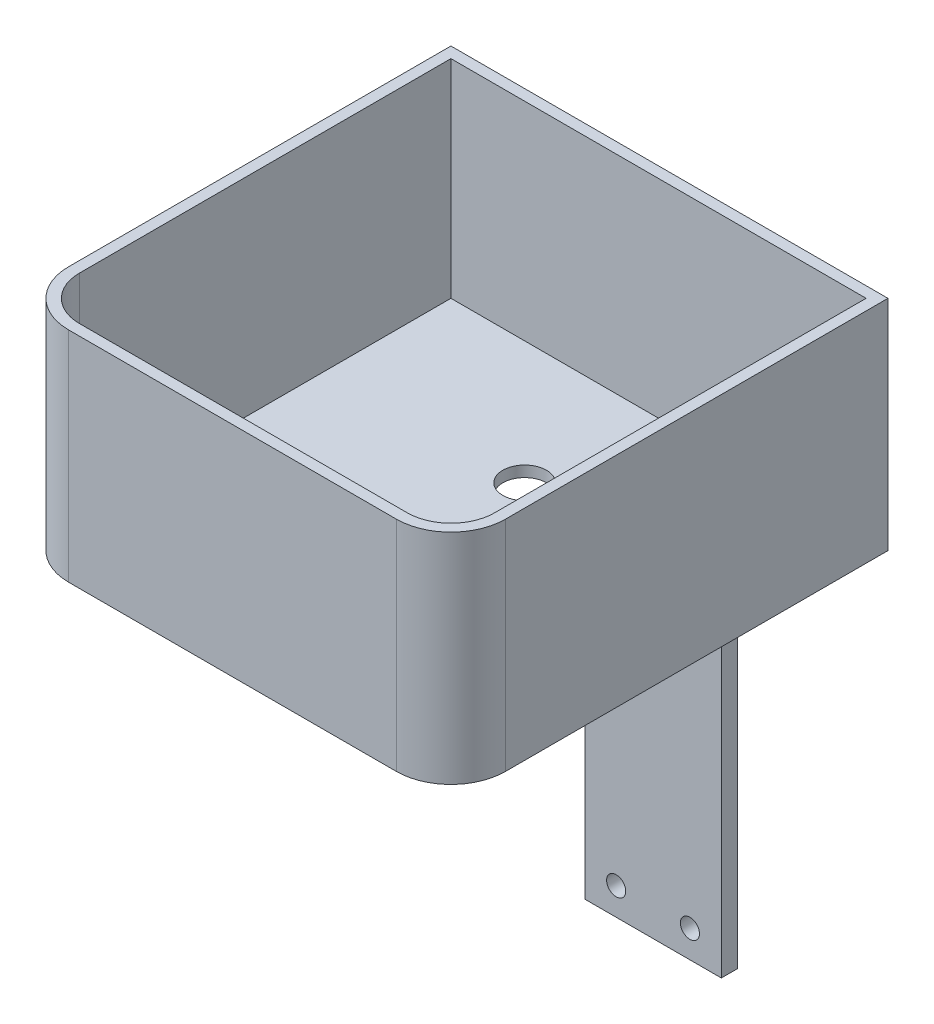
ISO-10303-21;
HEADER;
FILE_DESCRIPTION(('STEP AP214'),'2;1');
FILE_NAME('part.step','',(''),(''),'','','');
FILE_SCHEMA(('AUTOMOTIVE_DESIGN { 1 0 10303 214 1 1 1 1 }'));
ENDSEC;
DATA;
#1=APPLICATION_CONTEXT('core data for automotive mechanical design processes');
#2=APPLICATION_PROTOCOL_DEFINITION('international standard','automotive_design',2000,#1);
#3=PRODUCT_CONTEXT('',#1,'mechanical');
#4=PRODUCT('Part','Part','',(#3));
#5=PRODUCT_RELATED_PRODUCT_CATEGORY('part','',(#4));
#6=PRODUCT_DEFINITION_FORMATION('','',#4);
#7=PRODUCT_DEFINITION_CONTEXT('part definition',#1,'design');
#8=PRODUCT_DEFINITION('design','',#6,#7);
#9=PRODUCT_DEFINITION_SHAPE('','',#8);
#10=(LENGTH_UNIT() NAMED_UNIT(*) SI_UNIT(.MILLI.,.METRE.));
#11=(NAMED_UNIT(*) PLANE_ANGLE_UNIT() SI_UNIT($,.RADIAN.));
#12=(NAMED_UNIT(*) SI_UNIT($,.STERADIAN.) SOLID_ANGLE_UNIT());
#13=UNCERTAINTY_MEASURE_WITH_UNIT(LENGTH_MEASURE(1.E-05),#10,'distance_accuracy_value','');
#14=(GEOMETRIC_REPRESENTATION_CONTEXT(3) GLOBAL_UNCERTAINTY_ASSIGNED_CONTEXT((#13)) GLOBAL_UNIT_ASSIGNED_CONTEXT((#10,
#11,#12)) REPRESENTATION_CONTEXT('',''));
#15=CARTESIAN_POINT('',(0.,0.,0.));
#16=DIRECTION('',(0.,0.,1.));
#17=DIRECTION('',(1.,0.,0.));
#18=AXIS2_PLACEMENT_3D('',#15,#16,#17);
#19=CARTESIAN_POINT('',(0.,90.,3.));
#20=DIRECTION('',(0.,1.,0.));
#21=DIRECTION('',(-1.,0.,0.));
#22=AXIS2_PLACEMENT_3D('',#19,#20,#21);
#23=PLANE('',#22);
#24=DIRECTION('',(-1.,0.,0.));
#25=VECTOR('',#24,1.);
#26=CARTESIAN_POINT('',(-40.,90.,80.));
#27=LINE('',#26,#25);
#28=CARTESIAN_POINT('',(30.,90.,80.));
#29=VERTEX_POINT('',#28);
#30=CARTESIAN_POINT('',(-30.,90.,80.));
#31=VERTEX_POINT('',#30);
#32=EDGE_CURVE('E239',#29,#31,#27,.T.);
#33=ORIENTED_EDGE('',*,*,#32,.F.);
#34=CARTESIAN_POINT('',(30.,90.,70.));
#35=DIRECTION('',(0.,1.,0.));
#36=DIRECTION('',(-1.,0.,0.));
#37=AXIS2_PLACEMENT_3D('',#34,#35,#36);
#38=CIRCLE('',#37,10.);
#39=CARTESIAN_POINT('',(40.,90.,70.));
#40=VERTEX_POINT('',#39);
#41=EDGE_CURVE('E295',#29,#40,#38,.T.);
#42=ORIENTED_EDGE('',*,*,#41,.T.);
#43=DIRECTION('',(0.,0.,-1.));
#44=VECTOR('',#43,1.);
#45=CARTESIAN_POINT('',(40.,90.,3.));
#46=LINE('',#45,#44);
#47=CARTESIAN_POINT('',(40.,90.,0.));
#48=VERTEX_POINT('',#47);
#49=EDGE_CURVE('E283',#40,#48,#46,.T.);
#50=ORIENTED_EDGE('',*,*,#49,.T.);
#51=DIRECTION('',(1.,0.,0.));
#52=VECTOR('',#51,1.);
#53=CARTESIAN_POINT('',(0.,90.,0.));
#54=LINE('',#53,#52);
#55=CARTESIAN_POINT('',(-40.,90.,0.));
#56=VERTEX_POINT('',#55);
#57=EDGE_CURVE('E261',#56,#48,#54,.T.);
#58=ORIENTED_EDGE('',*,*,#57,.F.);
#59=DIRECTION('',(0.,0.,-1.));
#60=VECTOR('',#59,1.);
#61=CARTESIAN_POINT('',(-40.,90.,3.));
#62=LINE('',#61,#60);
#63=CARTESIAN_POINT('',(-40.,90.,70.));
#64=VERTEX_POINT('',#63);
#65=EDGE_CURVE('E281',#64,#56,#62,.T.);
#66=ORIENTED_EDGE('',*,*,#65,.F.);
#67=CARTESIAN_POINT('',(-30.,90.,70.));
#68=DIRECTION('',(0.,1.,0.));
#69=DIRECTION('',(-1.,0.,0.));
#70=AXIS2_PLACEMENT_3D('',#67,#68,#69);
#71=CIRCLE('',#70,10.);
#72=EDGE_CURVE('E293',#64,#31,#71,.T.);
#73=ORIENTED_EDGE('',*,*,#72,.T.);
#74=EDGE_LOOP('',(#33,#42,#50,#58,#66,#73));
#75=FACE_BOUND('',#74,.T.);
#76=CARTESIAN_POINT('',(30.,90.,70.));
#77=DIRECTION('',(0.,1.,0.));
#78=DIRECTION('',(-1.,0.,0.));
#79=AXIS2_PLACEMENT_3D('',#76,#77,#78);
#80=CIRCLE('',#79,8.);
#81=CARTESIAN_POINT('',(30.,90.,78.));
#82=VERTEX_POINT('',#81);
#83=CARTESIAN_POINT('',(38.,90.,70.));
#84=VERTEX_POINT('',#83);
#85=EDGE_CURVE('E234',#82,#84,#80,.T.);
#86=ORIENTED_EDGE('',*,*,#85,.F.);
#87=DIRECTION('',(-1.,0.,0.));
#88=VECTOR('',#87,1.);
#89=CARTESIAN_POINT('',(0.,90.,78.));
#90=LINE('',#89,#88);
#91=CARTESIAN_POINT('',(-30.,90.,78.));
#92=VERTEX_POINT('',#91);
#93=EDGE_CURVE('E211',#82,#92,#90,.T.);
#94=ORIENTED_EDGE('',*,*,#93,.T.);
#95=CARTESIAN_POINT('',(-30.,90.,70.));
#96=DIRECTION('',(0.,1.,0.));
#97=DIRECTION('',(-1.,0.,0.));
#98=AXIS2_PLACEMENT_3D('',#95,#96,#97);
#99=CIRCLE('',#98,8.);
#100=CARTESIAN_POINT('',(-38.,90.,70.));
#101=VERTEX_POINT('',#100);
#102=EDGE_CURVE('E229',#101,#92,#99,.T.);
#103=ORIENTED_EDGE('',*,*,#102,.F.);
#104=DIRECTION('',(0.,0.,-1.));
#105=VECTOR('',#104,1.);
#106=CARTESIAN_POINT('',(-38.,90.,3.));
#107=LINE('',#106,#105);
#108=CARTESIAN_POINT('',(-38.,90.,2.));
#109=VERTEX_POINT('',#108);
#110=EDGE_CURVE('E230',#101,#109,#107,.T.);
#111=ORIENTED_EDGE('',*,*,#110,.T.);
#112=DIRECTION('',(1.,0.,0.));
#113=VECTOR('',#112,1.);
#114=CARTESIAN_POINT('',(0.,90.,2.));
#115=LINE('',#114,#113);
#116=CARTESIAN_POINT('',(38.,90.,2.));
#117=VERTEX_POINT('',#116);
#118=EDGE_CURVE('E210',#109,#117,#115,.T.);
#119=ORIENTED_EDGE('',*,*,#118,.T.);
#120=DIRECTION('',(0.,0.,-1.));
#121=VECTOR('',#120,1.);
#122=CARTESIAN_POINT('',(38.,90.,3.));
#123=LINE('',#122,#121);
#124=EDGE_CURVE('E206',#84,#117,#123,.T.);
#125=ORIENTED_EDGE('',*,*,#124,.F.);
#126=EDGE_LOOP('',(#86,#94,#103,#111,#119,#125));
#127=FACE_BOUND('',#126,.T.);
#128=ADVANCED_FACE('F35',(#75,#127),#23,.T.);
#129=CARTESIAN_POINT('',(0.,0.,3.));
#130=DIRECTION('',(0.,0.,1.));
#131=DIRECTION('',(1.,0.,0.));
#132=AXIS2_PLACEMENT_3D('',#129,#130,#131);
#133=PLANE('',#132);
#134=CARTESIAN_POINT('',(-6.75,-25.,3.));
#135=DIRECTION('',(0.,0.,1.));
#136=DIRECTION('',(1.,0.,0.));
#137=AXIS2_PLACEMENT_3D('',#134,#135,#136);
#138=CIRCLE('',#137,1.75);
#139=CARTESIAN_POINT('',(-4.99999999999999,-25.,3.));
#140=VERTEX_POINT('',#139);
#141=EDGE_CURVE('E322',#140,#140,#138,.T.);
#142=ORIENTED_EDGE('',*,*,#141,.F.);
#143=EDGE_LOOP('',(#142));
#144=FACE_BOUND('',#143,.T.);
#145=CARTESIAN_POINT('',(6.75,-25.,3.));
#146=DIRECTION('',(0.,0.,1.));
#147=DIRECTION('',(1.,0.,0.));
#148=AXIS2_PLACEMENT_3D('',#145,#146,#147);
#149=CIRCLE('',#148,1.75);
#150=CARTESIAN_POINT('',(8.5,-25.,3.));
#151=VERTEX_POINT('',#150);
#152=EDGE_CURVE('E318',#151,#151,#149,.T.);
#153=ORIENTED_EDGE('',*,*,#152,.F.);
#154=EDGE_LOOP('',(#153));
#155=FACE_BOUND('',#154,.T.);
#156=CARTESIAN_POINT('',(6.75,25.,3.));
#157=DIRECTION('',(0.,0.,1.));
#158=DIRECTION('',(1.,0.,0.));
#159=AXIS2_PLACEMENT_3D('',#156,#157,#158);
#160=CIRCLE('',#159,1.75);
#161=CARTESIAN_POINT('',(8.49999999999999,25.,3.));
#162=VERTEX_POINT('',#161);
#163=EDGE_CURVE('E314',#162,#162,#160,.T.);
#164=ORIENTED_EDGE('',*,*,#163,.F.);
#165=EDGE_LOOP('',(#164));
#166=FACE_BOUND('',#165,.T.);
#167=CARTESIAN_POINT('',(-6.75,25.,3.));
#168=DIRECTION('',(0.,0.,1.));
#169=DIRECTION('',(1.,0.,0.));
#170=AXIS2_PLACEMENT_3D('',#167,#168,#169);
#171=CIRCLE('',#170,1.75);
#172=CARTESIAN_POINT('',(-5.,25.,3.));
#173=VERTEX_POINT('',#172);
#174=EDGE_CURVE('E310',#173,#173,#171,.T.);
#175=ORIENTED_EDGE('',*,*,#174,.F.);
#176=EDGE_LOOP('',(#175));
#177=FACE_BOUND('',#176,.T.);
#178=DIRECTION('',(0.,-1.,0.));
#179=VECTOR('',#178,1.);
#180=CARTESIAN_POINT('',(12.5,0.,3.));
#181=LINE('',#180,#179);
#182=CARTESIAN_POINT('',(12.5,23.7867965644036,3.));
#183=VERTEX_POINT('',#182);
#184=CARTESIAN_POINT('',(12.5,-30.,3.));
#185=VERTEX_POINT('',#184);
#186=EDGE_CURVE('E245',#183,#185,#181,.T.);
#187=ORIENTED_EDGE('',*,*,#186,.F.);
#188=CARTESIAN_POINT('',(27.5,23.7867965644036,3.));
#189=DIRECTION('',(0.,0.,1.));
#190=DIRECTION('',(1.,0.,0.));
#191=AXIS2_PLACEMENT_3D('',#188,#189,#190);
#192=CIRCLE('',#191,15.);
#193=CARTESIAN_POINT('',(16.8933982822018,34.3933982822018,3.));
#194=VERTEX_POINT('',#193);
#195=EDGE_CURVE('E357',#183,#194,#192,.F.);
#196=ORIENTED_EDGE('',*,*,#195,.T.);
#197=DIRECTION('',(-0.707106781186551,-0.707106781186544,0.));
#198=VECTOR('',#197,1.);
#199=CARTESIAN_POINT('',(32.5000000000001,50.,3.));
#200=LINE('',#199,#198);
#201=CARTESIAN_POINT('',(28.1066017177984,45.6066017177983,3.));
#202=VERTEX_POINT('',#201);
#203=EDGE_CURVE('E325',#194,#202,#200,.F.);
#204=ORIENTED_EDGE('',*,*,#203,.T.);
#205=CARTESIAN_POINT('',(38.7132034355965,35.,3.));
#206=DIRECTION('',(0.,0.,1.));
#207=DIRECTION('',(1.,0.,0.));
#208=AXIS2_PLACEMENT_3D('',#205,#206,#207);
#209=CIRCLE('',#208,15.);
#210=CARTESIAN_POINT('',(38.7132034355965,50.,3.));
#211=VERTEX_POINT('',#210);
#212=EDGE_CURVE('E354',#202,#211,#209,.F.);
#213=ORIENTED_EDGE('',*,*,#212,.T.);
#214=DIRECTION('',(-1.,0.,0.));
#215=VECTOR('',#214,1.);
#216=CARTESIAN_POINT('',(0.,50.,3.));
#217=LINE('',#216,#215);
#218=CARTESIAN_POINT('',(-38.7132034355964,50.,3.));
#219=VERTEX_POINT('',#218);
#220=EDGE_CURVE('E242',#211,#219,#217,.T.);
#221=ORIENTED_EDGE('',*,*,#220,.T.);
#222=CARTESIAN_POINT('',(-38.7132034355964,35.,3.));
#223=DIRECTION('',(0.,0.,1.));
#224=DIRECTION('',(1.,0.,0.));
#225=AXIS2_PLACEMENT_3D('',#222,#223,#224);
#226=CIRCLE('',#225,15.);
#227=CARTESIAN_POINT('',(-28.1066017177981,45.6066017177981,3.));
#228=VERTEX_POINT('',#227);
#229=EDGE_CURVE('E43',#219,#228,#226,.F.);
#230=ORIENTED_EDGE('',*,*,#229,.T.);
#231=DIRECTION('',(0.707106781186544,-0.707106781186551,0.));
#232=VECTOR('',#231,1.);
#233=CARTESIAN_POINT('',(-12.5,29.9999999999999,3.));
#234=LINE('',#233,#232);
#235=CARTESIAN_POINT('',(-16.8933982822017,34.3933982822017,3.));
#236=VERTEX_POINT('',#235);
#237=EDGE_CURVE('E330',#228,#236,#234,.T.);
#238=ORIENTED_EDGE('',*,*,#237,.T.);
#239=CARTESIAN_POINT('',(-27.5,23.7867965644035,3.));
#240=DIRECTION('',(0.,0.,1.));
#241=DIRECTION('',(1.,0.,0.));
#242=AXIS2_PLACEMENT_3D('',#239,#240,#241);
#243=CIRCLE('',#242,15.);
#244=CARTESIAN_POINT('',(-12.5,23.7867965644035,3.));
#245=VERTEX_POINT('',#244);
#246=EDGE_CURVE('E362',#236,#245,#243,.F.);
#247=ORIENTED_EDGE('',*,*,#246,.T.);
#248=DIRECTION('',(0.,-1.,0.));
#249=VECTOR('',#248,1.);
#250=CARTESIAN_POINT('',(-12.5,0.,3.));
#251=LINE('',#250,#249);
#252=CARTESIAN_POINT('',(-12.5,-30.,3.));
#253=VERTEX_POINT('',#252);
#254=EDGE_CURVE('E247',#245,#253,#251,.T.);
#255=ORIENTED_EDGE('',*,*,#254,.T.);
#256=DIRECTION('',(-1.,0.,0.));
#257=VECTOR('',#256,1.);
#258=CARTESIAN_POINT('',(0.,-30.,3.));
#259=LINE('',#258,#257);
#260=EDGE_CURVE('E250',#185,#253,#259,.T.);
#261=ORIENTED_EDGE('',*,*,#260,.F.);
#262=EDGE_LOOP('',(#187,#196,#204,#213,#221,#230,#238,#247,#255,#261));
#263=FACE_BOUND('',#262,.T.);
#264=ADVANCED_FACE('F366',(#144,#155,#166,#177,#263),#133,.T.);
#265=CARTESIAN_POINT('',(12.5,0.,3.));
#266=DIRECTION('',(1.,0.,0.));
#267=DIRECTION('',(0.,1.,0.));
#268=AXIS2_PLACEMENT_3D('',#265,#266,#267);
#269=PLANE('',#268);
#270=DIRECTION('',(0.,-1.,0.));
#271=VECTOR('',#270,1.);
#272=CARTESIAN_POINT('',(12.5,0.,0.));
#273=LINE('',#272,#271);
#274=CARTESIAN_POINT('',(12.5,23.7867965644036,0.));
#275=VERTEX_POINT('',#274);
#276=CARTESIAN_POINT('',(12.5,-30.,0.));
#277=VERTEX_POINT('',#276);
#278=EDGE_CURVE('E244',#275,#277,#273,.T.);
#279=ORIENTED_EDGE('',*,*,#278,.F.);
#280=DIRECTION('',(0.,0.,-1.));
#281=VECTOR('',#280,1.);
#282=CARTESIAN_POINT('',(12.5,23.7867965644036,3.));
#283=LINE('',#282,#281);
#284=EDGE_CURVE('E343',#275,#183,#283,.F.);
#285=ORIENTED_EDGE('',*,*,#284,.T.);
#286=ORIENTED_EDGE('',*,*,#186,.T.);
#287=DIRECTION('',(0.,0.,-1.));
#288=VECTOR('',#287,1.);
#289=CARTESIAN_POINT('',(12.5,-30.,3.));
#290=LINE('',#289,#288);
#291=EDGE_CURVE('E253',#185,#277,#290,.T.);
#292=ORIENTED_EDGE('',*,*,#291,.T.);
#293=EDGE_LOOP('',(#279,#285,#286,#292));
#294=FACE_BOUND('',#293,.T.);
#295=ADVANCED_FACE('F413',(#294),#269,.T.);
#296=CARTESIAN_POINT('',(40.,0.,3.));
#297=DIRECTION('',(1.,0.,0.));
#298=DIRECTION('',(0.,0.,-1.));
#299=AXIS2_PLACEMENT_3D('',#296,#297,#298);
#300=PLANE('',#299);
#301=ORIENTED_EDGE('',*,*,#49,.F.);
#302=DIRECTION('',(0.,1.,0.));
#303=VECTOR('',#302,1.);
#304=CARTESIAN_POINT('',(40.,50.,70.));
#305=LINE('',#304,#303);
#306=CARTESIAN_POINT('',(40.,50.,70.));
#307=VERTEX_POINT('',#306);
#308=EDGE_CURVE('E297',#40,#307,#305,.F.);
#309=ORIENTED_EDGE('',*,*,#308,.T.);
#310=DIRECTION('',(0.,0.,-1.));
#311=VECTOR('',#310,1.);
#312=CARTESIAN_POINT('',(40.,50.,3.));
#313=LINE('',#312,#311);
#314=CARTESIAN_POINT('',(40.,50.,0.));
#315=VERTEX_POINT('',#314);
#316=EDGE_CURVE('E285',#307,#315,#313,.T.);
#317=ORIENTED_EDGE('',*,*,#316,.T.);
#318=DIRECTION('',(0.,-1.,0.));
#319=VECTOR('',#318,1.);
#320=CARTESIAN_POINT('',(40.,0.,0.));
#321=LINE('',#320,#319);
#322=EDGE_CURVE('E258',#48,#315,#321,.T.);
#323=ORIENTED_EDGE('',*,*,#322,.F.);
#324=EDGE_LOOP('',(#301,#309,#317,#323));
#325=FACE_BOUND('',#324,.T.);
#326=ADVANCED_FACE('F393',(#325),#300,.T.);
#327=CARTESIAN_POINT('',(-40.,0.,3.));
#328=DIRECTION('',(-1.,0.,0.));
#329=DIRECTION('',(0.,0.,1.));
#330=AXIS2_PLACEMENT_3D('',#327,#328,#329);
#331=PLANE('',#330);
#332=DIRECTION('',(0.,0.,-1.));
#333=VECTOR('',#332,1.);
#334=CARTESIAN_POINT('',(-40.,50.,3.));
#335=LINE('',#334,#333);
#336=CARTESIAN_POINT('',(-40.,50.,70.));
#337=VERTEX_POINT('',#336);
#338=CARTESIAN_POINT('',(-40.,50.,0.));
#339=VERTEX_POINT('',#338);
#340=EDGE_CURVE('E278',#337,#339,#335,.T.);
#341=ORIENTED_EDGE('',*,*,#340,.F.);
#342=DIRECTION('',(0.,-1.,0.));
#343=VECTOR('',#342,1.);
#344=CARTESIAN_POINT('',(-40.,90.,70.));
#345=LINE('',#344,#343);
#346=EDGE_CURVE('E303',#337,#64,#345,.F.);
#347=ORIENTED_EDGE('',*,*,#346,.T.);
#348=ORIENTED_EDGE('',*,*,#65,.T.);
#349=DIRECTION('',(0.,1.,0.));
#350=VECTOR('',#349,1.);
#351=CARTESIAN_POINT('',(-40.,0.,0.));
#352=LINE('',#351,#350);
#353=EDGE_CURVE('E264',#339,#56,#352,.T.);
#354=ORIENTED_EDGE('',*,*,#353,.F.);
#355=EDGE_LOOP('',(#341,#347,#348,#354));
#356=FACE_BOUND('',#355,.T.);
#357=ADVANCED_FACE('F382',(#356),#331,.T.);
#358=CARTESIAN_POINT('',(0.,50.,3.));
#359=DIRECTION('',(0.,-1.,0.));
#360=DIRECTION('',(0.,0.,-1.));
#361=AXIS2_PLACEMENT_3D('',#358,#359,#360);
#362=PLANE('',#361);
#363=CARTESIAN_POINT('',(-2.00000000000001,50.,24.5));
#364=DIRECTION('',(0.,-1.,0.));
#365=DIRECTION('',(0.,0.,-1.));
#366=AXIS2_PLACEMENT_3D('',#363,#364,#365);
#367=CIRCLE('',#366,4.);
#368=CARTESIAN_POINT('',(-2.00000000000001,50.,20.5));
#369=VERTEX_POINT('',#368);
#370=EDGE_CURVE('E713',#369,#369,#367,.T.);
#371=ORIENTED_EDGE('',*,*,#370,.F.);
#372=EDGE_LOOP('',(#371));
#373=FACE_BOUND('',#372,.T.);
#374=ORIENTED_EDGE('',*,*,#220,.F.);
#375=DIRECTION('',(0.,0.,1.));
#376=VECTOR('',#375,1.);
#377=CARTESIAN_POINT('',(38.7132034355965,50.,3.));
#378=LINE('',#377,#376);
#379=CARTESIAN_POINT('',(38.7132034355965,50.,0.));
#380=VERTEX_POINT('',#379);
#381=EDGE_CURVE('E336',#211,#380,#378,.F.);
#382=ORIENTED_EDGE('',*,*,#381,.T.);
#383=DIRECTION('',(-1.,0.,0.));
#384=VECTOR('',#383,1.);
#385=CARTESIAN_POINT('',(0.,50.,0.));
#386=LINE('',#385,#384);
#387=EDGE_CURVE('E255',#315,#380,#386,.T.);
#388=ORIENTED_EDGE('',*,*,#387,.F.);
#389=ORIENTED_EDGE('',*,*,#316,.F.);
#390=CARTESIAN_POINT('',(30.,50.,70.));
#391=DIRECTION('',(0.,-1.,0.));
#392=DIRECTION('',(0.,0.,-1.));
#393=AXIS2_PLACEMENT_3D('',#390,#391,#392);
#394=CIRCLE('',#393,10.);
#395=CARTESIAN_POINT('',(30.,50.,80.));
#396=VERTEX_POINT('',#395);
#397=EDGE_CURVE('E301',#307,#396,#394,.T.);
#398=ORIENTED_EDGE('',*,*,#397,.T.);
#399=DIRECTION('',(1.,0.,0.));
#400=VECTOR('',#399,1.);
#401=CARTESIAN_POINT('',(-40.,50.,80.));
#402=LINE('',#401,#400);
#403=CARTESIAN_POINT('',(-30.,50.,80.));
#404=VERTEX_POINT('',#403);
#405=EDGE_CURVE('E224',#404,#396,#402,.T.);
#406=ORIENTED_EDGE('',*,*,#405,.F.);
#407=CARTESIAN_POINT('',(-30.,50.,70.));
#408=DIRECTION('',(0.,-1.,0.));
#409=DIRECTION('',(0.,0.,-1.));
#410=AXIS2_PLACEMENT_3D('',#407,#408,#409);
#411=CIRCLE('',#410,10.);
#412=EDGE_CURVE('E299',#404,#337,#411,.T.);
#413=ORIENTED_EDGE('',*,*,#412,.T.);
#414=ORIENTED_EDGE('',*,*,#340,.T.);
#415=DIRECTION('',(-1.,0.,0.));
#416=VECTOR('',#415,1.);
#417=CARTESIAN_POINT('',(0.,50.,0.));
#418=LINE('',#417,#416);
#419=CARTESIAN_POINT('',(-38.7132034355964,50.,0.));
#420=VERTEX_POINT('',#419);
#421=EDGE_CURVE('E267',#420,#339,#418,.T.);
#422=ORIENTED_EDGE('',*,*,#421,.F.);
#423=DIRECTION('',(0.,0.,1.));
#424=VECTOR('',#423,1.);
#425=CARTESIAN_POINT('',(-38.7132034355964,50.,3.));
#426=LINE('',#425,#424);
#427=EDGE_CURVE('E333',#420,#219,#426,.T.);
#428=ORIENTED_EDGE('',*,*,#427,.T.);
#429=EDGE_LOOP('',(#374,#382,#388,#389,#398,#406,#413,#414,#422,#428));
#430=FACE_BOUND('',#429,.T.);
#431=ADVANCED_FACE('F376',(#373,#430),#362,.T.);
#432=CARTESIAN_POINT('',(-12.5,0.,3.));
#433=DIRECTION('',(1.,0.,0.));
#434=DIRECTION('',(0.,1.,0.));
#435=AXIS2_PLACEMENT_3D('',#432,#433,#434);
#436=PLANE('',#435);
#437=ORIENTED_EDGE('',*,*,#254,.F.);
#438=DIRECTION('',(0.,0.,-1.));
#439=VECTOR('',#438,1.);
#440=CARTESIAN_POINT('',(-12.5,23.7867965644035,0.));
#441=LINE('',#440,#439);
#442=CARTESIAN_POINT('',(-12.5,23.7867965644035,0.));
#443=VERTEX_POINT('',#442);
#444=EDGE_CURVE('E346',#245,#443,#441,.T.);
#445=ORIENTED_EDGE('',*,*,#444,.T.);
#446=DIRECTION('',(0.,-1.,0.));
#447=VECTOR('',#446,1.);
#448=CARTESIAN_POINT('',(-12.5,0.,0.));
#449=LINE('',#448,#447);
#450=CARTESIAN_POINT('',(-12.5,-30.,0.));
#451=VERTEX_POINT('',#450);
#452=EDGE_CURVE('E269',#443,#451,#449,.T.);
#453=ORIENTED_EDGE('',*,*,#452,.T.);
#454=DIRECTION('',(0.,0.,-1.));
#455=VECTOR('',#454,1.);
#456=CARTESIAN_POINT('',(-12.5,-30.,3.));
#457=LINE('',#456,#455);
#458=EDGE_CURVE('E275',#253,#451,#457,.T.);
#459=ORIENTED_EDGE('',*,*,#458,.F.);
#460=EDGE_LOOP('',(#437,#445,#453,#459));
#461=FACE_BOUND('',#460,.T.);
#462=ADVANCED_FACE('F422',(#461),#436,.F.);
#463=CARTESIAN_POINT('',(0.,-30.,3.));
#464=DIRECTION('',(0.,-1.,0.));
#465=DIRECTION('',(1.,0.,0.));
#466=AXIS2_PLACEMENT_3D('',#463,#464,#465);
#467=PLANE('',#466);
#468=DIRECTION('',(-1.,0.,0.));
#469=VECTOR('',#468,1.);
#470=CARTESIAN_POINT('',(0.,-30.,0.));
#471=LINE('',#470,#469);
#472=EDGE_CURVE('E248',#277,#451,#471,.T.);
#473=ORIENTED_EDGE('',*,*,#472,.F.);
#474=ORIENTED_EDGE('',*,*,#291,.F.);
#475=ORIENTED_EDGE('',*,*,#260,.T.);
#476=ORIENTED_EDGE('',*,*,#458,.T.);
#477=EDGE_LOOP('',(#473,#474,#475,#476));
#478=FACE_BOUND('',#477,.T.);
#479=ADVANCED_FACE('F418',(#478),#467,.T.);
#480=CARTESIAN_POINT('',(0.,0.,0.));
#481=DIRECTION('',(0.,0.,1.));
#482=DIRECTION('',(1.,0.,0.));
#483=AXIS2_PLACEMENT_3D('',#480,#481,#482);
#484=PLANE('',#483);
#485=CARTESIAN_POINT('',(-6.75,-25.,0.));
#486=DIRECTION('',(0.,0.,1.));
#487=DIRECTION('',(1.,0.,0.));
#488=AXIS2_PLACEMENT_3D('',#485,#486,#487);
#489=CIRCLE('',#488,1.75);
#490=CARTESIAN_POINT('',(-4.99999999999999,-25.,0.));
#491=VERTEX_POINT('',#490);
#492=EDGE_CURVE('E319',#491,#491,#489,.T.);
#493=ORIENTED_EDGE('',*,*,#492,.T.);
#494=EDGE_LOOP('',(#493));
#495=FACE_BOUND('',#494,.T.);
#496=CARTESIAN_POINT('',(6.75,-25.,0.));
#497=DIRECTION('',(0.,0.,1.));
#498=DIRECTION('',(1.,0.,0.));
#499=AXIS2_PLACEMENT_3D('',#496,#497,#498);
#500=CIRCLE('',#499,1.75);
#501=CARTESIAN_POINT('',(8.5,-25.,0.));
#502=VERTEX_POINT('',#501);
#503=EDGE_CURVE('E315',#502,#502,#500,.T.);
#504=ORIENTED_EDGE('',*,*,#503,.T.);
#505=EDGE_LOOP('',(#504));
#506=FACE_BOUND('',#505,.T.);
#507=CARTESIAN_POINT('',(6.75,25.,0.));
#508=DIRECTION('',(0.,0.,1.));
#509=DIRECTION('',(1.,0.,0.));
#510=AXIS2_PLACEMENT_3D('',#507,#508,#509);
#511=CIRCLE('',#510,1.75);
#512=CARTESIAN_POINT('',(8.49999999999999,25.,0.));
#513=VERTEX_POINT('',#512);
#514=EDGE_CURVE('E311',#513,#513,#511,.T.);
#515=ORIENTED_EDGE('',*,*,#514,.T.);
#516=EDGE_LOOP('',(#515));
#517=FACE_BOUND('',#516,.T.);
#518=CARTESIAN_POINT('',(-6.75,25.,0.));
#519=DIRECTION('',(0.,0.,1.));
#520=DIRECTION('',(1.,0.,0.));
#521=AXIS2_PLACEMENT_3D('',#518,#519,#520);
#522=CIRCLE('',#521,1.75);
#523=CARTESIAN_POINT('',(-5.,25.,0.));
#524=VERTEX_POINT('',#523);
#525=EDGE_CURVE('E306',#524,#524,#522,.T.);
#526=ORIENTED_EDGE('',*,*,#525,.T.);
#527=EDGE_LOOP('',(#526));
#528=FACE_BOUND('',#527,.T.);
#529=ORIENTED_EDGE('',*,*,#387,.T.);
#530=CARTESIAN_POINT('',(38.7132034355965,35.,0.));
#531=DIRECTION('',(0.,0.,1.));
#532=DIRECTION('',(1.,0.,0.));
#533=AXIS2_PLACEMENT_3D('',#530,#531,#532);
#534=CIRCLE('',#533,15.);
#535=CARTESIAN_POINT('',(28.1066017177984,45.6066017177983,0.));
#536=VERTEX_POINT('',#535);
#537=EDGE_CURVE('E352',#380,#536,#534,.T.);
#538=ORIENTED_EDGE('',*,*,#537,.T.);
#539=DIRECTION('',(0.707106781186551,0.707106781186544,0.));
#540=VECTOR('',#539,1.);
#541=CARTESIAN_POINT('',(-8.75000000000009,8.75000000000018,0.));
#542=LINE('',#541,#540);
#543=CARTESIAN_POINT('',(16.8933982822018,34.3933982822018,0.));
#544=VERTEX_POINT('',#543);
#545=EDGE_CURVE('E305',#536,#544,#542,.F.);
#546=ORIENTED_EDGE('',*,*,#545,.T.);
#547=CARTESIAN_POINT('',(27.5,23.7867965644036,0.));
#548=DIRECTION('',(0.,0.,1.));
#549=DIRECTION('',(1.,0.,0.));
#550=AXIS2_PLACEMENT_3D('',#547,#548,#549);
#551=CIRCLE('',#550,15.);
#552=EDGE_CURVE('E359',#544,#275,#551,.T.);
#553=ORIENTED_EDGE('',*,*,#552,.T.);
#554=ORIENTED_EDGE('',*,*,#278,.T.);
#555=ORIENTED_EDGE('',*,*,#472,.T.);
#556=ORIENTED_EDGE('',*,*,#452,.F.);
#557=CARTESIAN_POINT('',(-27.5,23.7867965644035,0.));
#558=DIRECTION('',(0.,0.,1.));
#559=DIRECTION('',(1.,0.,0.));
#560=AXIS2_PLACEMENT_3D('',#557,#558,#559);
#561=CIRCLE('',#560,15.);
#562=CARTESIAN_POINT('',(-16.8933982822017,34.3933982822017,0.));
#563=VERTEX_POINT('',#562);
#564=EDGE_CURVE('E57',#443,#563,#561,.T.);
#565=ORIENTED_EDGE('',*,*,#564,.T.);
#566=DIRECTION('',(-0.707106781186544,0.707106781186551,0.));
#567=VECTOR('',#566,1.);
#568=CARTESIAN_POINT('',(8.74999999999988,8.74999999999979,0.));
#569=LINE('',#568,#567);
#570=CARTESIAN_POINT('',(-28.1066017177981,45.6066017177981,0.));
#571=VERTEX_POINT('',#570);
#572=EDGE_CURVE('E328',#563,#571,#569,.T.);
#573=ORIENTED_EDGE('',*,*,#572,.T.);
#574=CARTESIAN_POINT('',(-38.7132034355964,35.,0.));
#575=DIRECTION('',(0.,0.,1.));
#576=DIRECTION('',(1.,0.,0.));
#577=AXIS2_PLACEMENT_3D('',#574,#575,#576);
#578=CIRCLE('',#577,15.);
#579=EDGE_CURVE('E11',#571,#420,#578,.T.);
#580=ORIENTED_EDGE('',*,*,#579,.T.);
#581=ORIENTED_EDGE('',*,*,#421,.T.);
#582=ORIENTED_EDGE('',*,*,#353,.T.);
#583=ORIENTED_EDGE('',*,*,#57,.T.);
#584=ORIENTED_EDGE('',*,*,#322,.T.);
#585=EDGE_LOOP('',(#529,#538,#546,#553,#554,#555,#556,#565,#573,#580,#581,#582,#583,#584));
#586=FACE_BOUND('',#585,.T.);
#587=ADVANCED_FACE('F374',(#495,#506,#517,#528,#586),#484,.F.);
#588=CARTESIAN_POINT('',(0.,0.,80.));
#589=DIRECTION('',(0.,0.,-1.));
#590=DIRECTION('',(-1.,0.,0.));
#591=AXIS2_PLACEMENT_3D('',#588,#589,#590);
#592=PLANE('',#591);
#593=ORIENTED_EDGE('',*,*,#405,.T.);
#594=DIRECTION('',(0.,1.,0.));
#595=VECTOR('',#594,1.);
#596=CARTESIAN_POINT('',(30.,90.,80.));
#597=LINE('',#596,#595);
#598=EDGE_CURVE('E290',#396,#29,#597,.T.);
#599=ORIENTED_EDGE('',*,*,#598,.T.);
#600=ORIENTED_EDGE('',*,*,#32,.T.);
#601=DIRECTION('',(0.,-1.,0.));
#602=VECTOR('',#601,1.);
#603=CARTESIAN_POINT('',(-30.,50.,80.));
#604=LINE('',#603,#602);
#605=EDGE_CURVE('E287',#31,#404,#604,.T.);
#606=ORIENTED_EDGE('',*,*,#605,.T.);
#607=EDGE_LOOP('',(#593,#599,#600,#606));
#608=FACE_BOUND('',#607,.T.);
#609=ADVANCED_FACE('F450',(#608),#592,.F.);
#610=CARTESIAN_POINT('',(30.,0.,70.));
#611=DIRECTION('',(0.,-1.,0.));
#612=DIRECTION('',(0.,0.,-1.));
#613=AXIS2_PLACEMENT_3D('',#610,#611,#612);
#614=CYLINDRICAL_SURFACE('',#613,10.);
#615=ORIENTED_EDGE('',*,*,#397,.F.);
#616=ORIENTED_EDGE('',*,*,#308,.F.);
#617=ORIENTED_EDGE('',*,*,#41,.F.);
#618=ORIENTED_EDGE('',*,*,#598,.F.);
#619=EDGE_LOOP('',(#615,#616,#617,#618));
#620=FACE_BOUND('',#619,.T.);
#621=ADVANCED_FACE('F446',(#620),#614,.T.);
#622=CARTESIAN_POINT('',(-30.,0.,70.));
#623=DIRECTION('',(0.,1.,0.));
#624=DIRECTION('',(0.,0.,1.));
#625=AXIS2_PLACEMENT_3D('',#622,#623,#624);
#626=CYLINDRICAL_SURFACE('',#625,10.);
#627=ORIENTED_EDGE('',*,*,#72,.F.);
#628=ORIENTED_EDGE('',*,*,#346,.F.);
#629=ORIENTED_EDGE('',*,*,#412,.F.);
#630=ORIENTED_EDGE('',*,*,#605,.F.);
#631=EDGE_LOOP('',(#627,#628,#629,#630));
#632=FACE_BOUND('',#631,.T.);
#633=ADVANCED_FACE('F449',(#632),#626,.T.);
#634=CARTESIAN_POINT('',(38.,0.,3.));
#635=DIRECTION('',(1.,0.,0.));
#636=DIRECTION('',(0.,0.,-1.));
#637=AXIS2_PLACEMENT_3D('',#634,#635,#636);
#638=PLANE('',#637);
#639=ORIENTED_EDGE('',*,*,#124,.T.);
#640=DIRECTION('',(0.,-1.,0.));
#641=VECTOR('',#640,1.);
#642=CARTESIAN_POINT('',(38.,0.,2.));
#643=LINE('',#642,#641);
#644=CARTESIAN_POINT('',(38.,52.,2.));
#645=VERTEX_POINT('',#644);
#646=EDGE_CURVE('E189',#117,#645,#643,.T.);
#647=ORIENTED_EDGE('',*,*,#646,.T.);
#648=DIRECTION('',(0.,0.,-1.));
#649=VECTOR('',#648,1.);
#650=CARTESIAN_POINT('',(38.,52.,3.));
#651=LINE('',#650,#649);
#652=CARTESIAN_POINT('',(38.,52.,70.));
#653=VERTEX_POINT('',#652);
#654=EDGE_CURVE('E199',#653,#645,#651,.T.);
#655=ORIENTED_EDGE('',*,*,#654,.F.);
#656=DIRECTION('',(0.,1.,0.));
#657=VECTOR('',#656,1.);
#658=CARTESIAN_POINT('',(38.,0.,70.));
#659=LINE('',#658,#657);
#660=EDGE_CURVE('E219',#84,#653,#659,.F.);
#661=ORIENTED_EDGE('',*,*,#660,.F.);
#662=EDGE_LOOP('',(#639,#647,#655,#661));
#663=FACE_BOUND('',#662,.T.);
#664=ADVANCED_FACE('F208',(#663),#638,.F.);
#665=CARTESIAN_POINT('',(-38.,0.,3.));
#666=DIRECTION('',(-1.,0.,0.));
#667=DIRECTION('',(0.,0.,1.));
#668=AXIS2_PLACEMENT_3D('',#665,#666,#667);
#669=PLANE('',#668);
#670=DIRECTION('',(0.,0.,-1.));
#671=VECTOR('',#670,1.);
#672=CARTESIAN_POINT('',(-38.,52.,3.));
#673=LINE('',#672,#671);
#674=CARTESIAN_POINT('',(-38.,52.,70.));
#675=VERTEX_POINT('',#674);
#676=CARTESIAN_POINT('',(-38.,52.,2.));
#677=VERTEX_POINT('',#676);
#678=EDGE_CURVE('E195',#675,#677,#673,.T.);
#679=ORIENTED_EDGE('',*,*,#678,.T.);
#680=DIRECTION('',(0.,1.,0.));
#681=VECTOR('',#680,1.);
#682=CARTESIAN_POINT('',(-38.,0.,2.));
#683=LINE('',#682,#681);
#684=EDGE_CURVE('E192',#677,#109,#683,.T.);
#685=ORIENTED_EDGE('',*,*,#684,.T.);
#686=ORIENTED_EDGE('',*,*,#110,.F.);
#687=DIRECTION('',(0.,1.,0.));
#688=VECTOR('',#687,1.);
#689=CARTESIAN_POINT('',(-38.,0.,70.));
#690=LINE('',#689,#688);
#691=EDGE_CURVE('E221',#675,#101,#690,.T.);
#692=ORIENTED_EDGE('',*,*,#691,.F.);
#693=EDGE_LOOP('',(#679,#685,#686,#692));
#694=FACE_BOUND('',#693,.T.);
#695=ADVANCED_FACE('F582',(#694),#669,.F.);
#696=CARTESIAN_POINT('',(0.,52.,3.));
#697=DIRECTION('',(0.,-1.,0.));
#698=DIRECTION('',(0.,0.,-1.));
#699=AXIS2_PLACEMENT_3D('',#696,#697,#698);
#700=PLANE('',#699);
#701=CARTESIAN_POINT('',(-2.00000000000001,52.,24.5));
#702=DIRECTION('',(0.,1.,0.));
#703=DIRECTION('',(0.,0.,1.));
#704=AXIS2_PLACEMENT_3D('',#701,#702,#703);
#705=CIRCLE('',#704,4.);
#706=CARTESIAN_POINT('',(-2.00000000000001,52.,28.5));
#707=VERTEX_POINT('',#706);
#708=EDGE_CURVE('E309',#707,#707,#705,.T.);
#709=ORIENTED_EDGE('',*,*,#708,.F.);
#710=EDGE_LOOP('',(#709));
#711=FACE_BOUND('',#710,.T.);
#712=DIRECTION('',(-1.,0.,0.));
#713=VECTOR('',#712,1.);
#714=CARTESIAN_POINT('',(0.,52.,2.));
#715=LINE('',#714,#713);
#716=EDGE_CURVE('E185',#645,#677,#715,.T.);
#717=ORIENTED_EDGE('',*,*,#716,.T.);
#718=ORIENTED_EDGE('',*,*,#678,.F.);
#719=CARTESIAN_POINT('',(-30.,52.,70.));
#720=DIRECTION('',(0.,-1.,0.));
#721=DIRECTION('',(0.,0.,-1.));
#722=AXIS2_PLACEMENT_3D('',#719,#720,#721);
#723=CIRCLE('',#722,8.);
#724=CARTESIAN_POINT('',(-30.,52.,78.));
#725=VERTEX_POINT('',#724);
#726=EDGE_CURVE('E721',#725,#675,#723,.T.);
#727=ORIENTED_EDGE('',*,*,#726,.F.);
#728=DIRECTION('',(1.,0.,0.));
#729=VECTOR('',#728,1.);
#730=CARTESIAN_POINT('',(0.,52.,78.));
#731=LINE('',#730,#729);
#732=CARTESIAN_POINT('',(30.,52.,78.));
#733=VERTEX_POINT('',#732);
#734=EDGE_CURVE('E215',#725,#733,#731,.T.);
#735=ORIENTED_EDGE('',*,*,#734,.T.);
#736=CARTESIAN_POINT('',(30.,52.,70.));
#737=DIRECTION('',(0.,-1.,0.));
#738=DIRECTION('',(0.,0.,-1.));
#739=AXIS2_PLACEMENT_3D('',#736,#737,#738);
#740=CIRCLE('',#739,8.);
#741=EDGE_CURVE('E202',#653,#733,#740,.T.);
#742=ORIENTED_EDGE('',*,*,#741,.F.);
#743=ORIENTED_EDGE('',*,*,#654,.T.);
#744=EDGE_LOOP('',(#717,#718,#727,#735,#742,#743));
#745=FACE_BOUND('',#744,.T.);
#746=ADVANCED_FACE('F200',(#711,#745),#700,.F.);
#747=CARTESIAN_POINT('',(0.,0.,2.));
#748=DIRECTION('',(0.,0.,1.));
#749=DIRECTION('',(1.,0.,0.));
#750=AXIS2_PLACEMENT_3D('',#747,#748,#749);
#751=PLANE('',#750);
#752=ORIENTED_EDGE('',*,*,#646,.F.);
#753=ORIENTED_EDGE('',*,*,#118,.F.);
#754=ORIENTED_EDGE('',*,*,#684,.F.);
#755=ORIENTED_EDGE('',*,*,#716,.F.);
#756=EDGE_LOOP('',(#752,#753,#754,#755));
#757=FACE_BOUND('',#756,.T.);
#758=ADVANCED_FACE('F187',(#757),#751,.T.);
#759=CARTESIAN_POINT('',(0.,0.,78.));
#760=DIRECTION('',(0.,0.,-1.));
#761=DIRECTION('',(-1.,0.,0.));
#762=AXIS2_PLACEMENT_3D('',#759,#760,#761);
#763=PLANE('',#762);
#764=ORIENTED_EDGE('',*,*,#734,.F.);
#765=DIRECTION('',(0.,1.,0.));
#766=VECTOR('',#765,1.);
#767=CARTESIAN_POINT('',(-30.,0.,78.));
#768=LINE('',#767,#766);
#769=EDGE_CURVE('E205',#92,#725,#768,.F.);
#770=ORIENTED_EDGE('',*,*,#769,.F.);
#771=ORIENTED_EDGE('',*,*,#93,.F.);
#772=DIRECTION('',(0.,1.,0.));
#773=VECTOR('',#772,1.);
#774=CARTESIAN_POINT('',(30.,0.,78.));
#775=LINE('',#774,#773);
#776=EDGE_CURVE('E227',#733,#82,#775,.T.);
#777=ORIENTED_EDGE('',*,*,#776,.F.);
#778=EDGE_LOOP('',(#764,#770,#771,#777));
#779=FACE_BOUND('',#778,.T.);
#780=ADVANCED_FACE('F557',(#779),#763,.T.);
#781=CARTESIAN_POINT('',(30.,0.,70.));
#782=DIRECTION('',(0.,-1.,0.));
#783=DIRECTION('',(0.,0.,-1.));
#784=AXIS2_PLACEMENT_3D('',#781,#782,#783);
#785=CYLINDRICAL_SURFACE('',#784,8.);
#786=ORIENTED_EDGE('',*,*,#741,.T.);
#787=ORIENTED_EDGE('',*,*,#776,.T.);
#788=ORIENTED_EDGE('',*,*,#85,.T.);
#789=ORIENTED_EDGE('',*,*,#660,.T.);
#790=EDGE_LOOP('',(#786,#787,#788,#789));
#791=FACE_BOUND('',#790,.T.);
#792=ADVANCED_FACE('F548',(#791),#785,.F.);
#793=CARTESIAN_POINT('',(-30.,0.,70.));
#794=DIRECTION('',(0.,1.,0.));
#795=DIRECTION('',(0.,0.,1.));
#796=AXIS2_PLACEMENT_3D('',#793,#794,#795);
#797=CYLINDRICAL_SURFACE('',#796,8.);
#798=ORIENTED_EDGE('',*,*,#102,.T.);
#799=ORIENTED_EDGE('',*,*,#769,.T.);
#800=ORIENTED_EDGE('',*,*,#726,.T.);
#801=ORIENTED_EDGE('',*,*,#691,.T.);
#802=EDGE_LOOP('',(#798,#799,#800,#801));
#803=FACE_BOUND('',#802,.T.);
#804=ADVANCED_FACE('F538',(#803),#797,.F.);
#805=CARTESIAN_POINT('',(-2.00000000000001,-48.,24.5));
#806=DIRECTION('',(0.,1.,0.));
#807=DIRECTION('',(0.,0.,1.));
#808=AXIS2_PLACEMENT_3D('',#805,#806,#807);
#809=CYLINDRICAL_SURFACE('',#808,4.);
#810=ORIENTED_EDGE('',*,*,#370,.T.);
#811=EDGE_LOOP('',(#810));
#812=FACE_BOUND('',#811,.T.);
#813=ORIENTED_EDGE('',*,*,#708,.T.);
#814=EDGE_LOOP('',(#813));
#815=FACE_BOUND('',#814,.T.);
#816=ADVANCED_FACE('F529',(#812,#815),#809,.F.);
#817=CARTESIAN_POINT('',(-6.75,25.,-97.));
#818=DIRECTION('',(0.,0.,1.));
#819=DIRECTION('',(1.,0.,0.));
#820=AXIS2_PLACEMENT_3D('',#817,#818,#819);
#821=CYLINDRICAL_SURFACE('',#820,1.75);
#822=ORIENTED_EDGE('',*,*,#174,.T.);
#823=EDGE_LOOP('',(#822));
#824=FACE_BOUND('',#823,.T.);
#825=ORIENTED_EDGE('',*,*,#525,.F.);
#826=EDGE_LOOP('',(#825));
#827=FACE_BOUND('',#826,.T.);
#828=ADVANCED_FACE('F520',(#824,#827),#821,.F.);
#829=CARTESIAN_POINT('',(6.75,25.,-97.));
#830=DIRECTION('',(0.,0.,1.));
#831=DIRECTION('',(1.,0.,0.));
#832=AXIS2_PLACEMENT_3D('',#829,#830,#831);
#833=CYLINDRICAL_SURFACE('',#832,1.75);
#834=ORIENTED_EDGE('',*,*,#163,.T.);
#835=EDGE_LOOP('',(#834));
#836=FACE_BOUND('',#835,.T.);
#837=ORIENTED_EDGE('',*,*,#514,.F.);
#838=EDGE_LOOP('',(#837));
#839=FACE_BOUND('',#838,.T.);
#840=ADVANCED_FACE('F511',(#836,#839),#833,.F.);
#841=CARTESIAN_POINT('',(6.75,-25.,-97.));
#842=DIRECTION('',(0.,0.,1.));
#843=DIRECTION('',(1.,0.,0.));
#844=AXIS2_PLACEMENT_3D('',#841,#842,#843);
#845=CYLINDRICAL_SURFACE('',#844,1.75);
#846=ORIENTED_EDGE('',*,*,#152,.T.);
#847=EDGE_LOOP('',(#846));
#848=FACE_BOUND('',#847,.T.);
#849=ORIENTED_EDGE('',*,*,#503,.F.);
#850=EDGE_LOOP('',(#849));
#851=FACE_BOUND('',#850,.T.);
#852=ADVANCED_FACE('F501',(#848,#851),#845,.F.);
#853=CARTESIAN_POINT('',(-6.75,-25.,-97.));
#854=DIRECTION('',(0.,0.,1.));
#855=DIRECTION('',(1.,0.,0.));
#856=AXIS2_PLACEMENT_3D('',#853,#854,#855);
#857=CYLINDRICAL_SURFACE('',#856,1.75);
#858=ORIENTED_EDGE('',*,*,#141,.T.);
#859=EDGE_LOOP('',(#858));
#860=FACE_BOUND('',#859,.T.);
#861=ORIENTED_EDGE('',*,*,#492,.F.);
#862=EDGE_LOOP('',(#861));
#863=FACE_BOUND('',#862,.T.);
#864=ADVANCED_FACE('F457',(#860,#863),#857,.F.);
#865=CARTESIAN_POINT('',(32.5000000000001,50.,3.));
#866=DIRECTION('',(0.707106781186544,-0.707106781186551,0.));
#867=DIRECTION('',(0.,0.,1.));
#868=AXIS2_PLACEMENT_3D('',#865,#866,#867);
#869=PLANE('',#868);
#870=ORIENTED_EDGE('',*,*,#545,.F.);
#871=DIRECTION('',(0.,0.,-1.));
#872=VECTOR('',#871,1.);
#873=CARTESIAN_POINT('',(28.1066017177984,45.6066017177983,3.));
#874=LINE('',#873,#872);
#875=EDGE_CURVE('E341',#536,#202,#874,.F.);
#876=ORIENTED_EDGE('',*,*,#875,.T.);
#877=ORIENTED_EDGE('',*,*,#203,.F.);
#878=DIRECTION('',(0.,0.,1.));
#879=VECTOR('',#878,1.);
#880=CARTESIAN_POINT('',(16.8933982822018,34.3933982822018,3.));
#881=LINE('',#880,#879);
#882=EDGE_CURVE('E339',#194,#544,#881,.F.);
#883=ORIENTED_EDGE('',*,*,#882,.T.);
#884=EDGE_LOOP('',(#870,#876,#877,#883));
#885=FACE_BOUND('',#884,.T.);
#886=ADVANCED_FACE('F403',(#885),#869,.T.);
#887=CARTESIAN_POINT('',(-12.5,29.9999999999999,3.));
#888=DIRECTION('',(0.707106781186551,0.707106781186544,0.));
#889=DIRECTION('',(0.,0.,-1.));
#890=AXIS2_PLACEMENT_3D('',#887,#888,#889);
#891=PLANE('',#890);
#892=ORIENTED_EDGE('',*,*,#572,.F.);
#893=DIRECTION('',(0.,0.,-1.));
#894=VECTOR('',#893,1.);
#895=CARTESIAN_POINT('',(-16.8933982822017,34.3933982822017,3.));
#896=LINE('',#895,#894);
#897=EDGE_CURVE('E350',#563,#236,#896,.F.);
#898=ORIENTED_EDGE('',*,*,#897,.T.);
#899=ORIENTED_EDGE('',*,*,#237,.F.);
#900=DIRECTION('',(0.,0.,1.));
#901=VECTOR('',#900,1.);
#902=CARTESIAN_POINT('',(-28.1066017177981,45.6066017177981,3.));
#903=LINE('',#902,#901);
#904=EDGE_CURVE('E50',#228,#571,#903,.F.);
#905=ORIENTED_EDGE('',*,*,#904,.T.);
#906=EDGE_LOOP('',(#892,#898,#899,#905));
#907=FACE_BOUND('',#906,.T.);
#908=ADVANCED_FACE('F370',(#907),#891,.F.);
#909=CARTESIAN_POINT('',(38.7132034355965,35.,3.));
#910=DIRECTION('',(0.,0.,1.));
#911=DIRECTION('',(1.,0.,0.));
#912=AXIS2_PLACEMENT_3D('',#909,#910,#911);
#913=CYLINDRICAL_SURFACE('',#912,15.);
#914=ORIENTED_EDGE('',*,*,#212,.F.);
#915=ORIENTED_EDGE('',*,*,#875,.F.);
#916=ORIENTED_EDGE('',*,*,#537,.F.);
#917=ORIENTED_EDGE('',*,*,#381,.F.);
#918=EDGE_LOOP('',(#914,#915,#916,#917));
#919=FACE_BOUND('',#918,.T.);
#920=ADVANCED_FACE('F407',(#919),#913,.F.);
#921=CARTESIAN_POINT('',(27.5,23.7867965644036,3.));
#922=DIRECTION('',(0.,0.,-1.));
#923=DIRECTION('',(-1.,0.,0.));
#924=AXIS2_PLACEMENT_3D('',#921,#922,#923);
#925=CYLINDRICAL_SURFACE('',#924,15.);
#926=ORIENTED_EDGE('',*,*,#552,.F.);
#927=ORIENTED_EDGE('',*,*,#882,.F.);
#928=ORIENTED_EDGE('',*,*,#195,.F.);
#929=ORIENTED_EDGE('',*,*,#284,.F.);
#930=EDGE_LOOP('',(#926,#927,#928,#929));
#931=FACE_BOUND('',#930,.T.);
#932=ADVANCED_FACE('F409',(#931),#925,.F.);
#933=CARTESIAN_POINT('',(-27.5,23.7867965644035,3.));
#934=DIRECTION('',(0.,0.,1.));
#935=DIRECTION('',(1.,0.,0.));
#936=AXIS2_PLACEMENT_3D('',#933,#934,#935);
#937=CYLINDRICAL_SURFACE('',#936,15.);
#938=ORIENTED_EDGE('',*,*,#246,.F.);
#939=ORIENTED_EDGE('',*,*,#897,.F.);
#940=ORIENTED_EDGE('',*,*,#564,.F.);
#941=ORIENTED_EDGE('',*,*,#444,.F.);
#942=EDGE_LOOP('',(#938,#939,#940,#941));
#943=FACE_BOUND('',#942,.T.);
#944=ADVANCED_FACE('F425',(#943),#937,.F.);
#945=CARTESIAN_POINT('',(-38.7132034355964,35.,3.));
#946=DIRECTION('',(0.,0.,1.));
#947=DIRECTION('',(1.,0.,0.));
#948=AXIS2_PLACEMENT_3D('',#945,#946,#947);
#949=CYLINDRICAL_SURFACE('',#948,15.);
#950=ORIENTED_EDGE('',*,*,#579,.F.);
#951=ORIENTED_EDGE('',*,*,#904,.F.);
#952=ORIENTED_EDGE('',*,*,#229,.F.);
#953=ORIENTED_EDGE('',*,*,#427,.F.);
#954=EDGE_LOOP('',(#950,#951,#952,#953));
#955=FACE_BOUND('',#954,.T.);
#956=ADVANCED_FACE('F37',(#955),#949,.F.);
#957=CLOSED_SHELL('',(#128,#264,#295,#326,#357,#431,#462,#479,#587,#609,#621,#633,#664,#695,
#746,#758,#780,#792,#804,#816,#828,#840,#852,#864,#886,#908,#920,#932,#944,#956));
#958=MANIFOLD_SOLID_BREP('B2',#957);
#959=ADVANCED_BREP_SHAPE_REPRESENTATION('',(#18,#958),#14);
#960=SHAPE_DEFINITION_REPRESENTATION(#9,#959);
ENDSEC;
END-ISO-10303-21;
